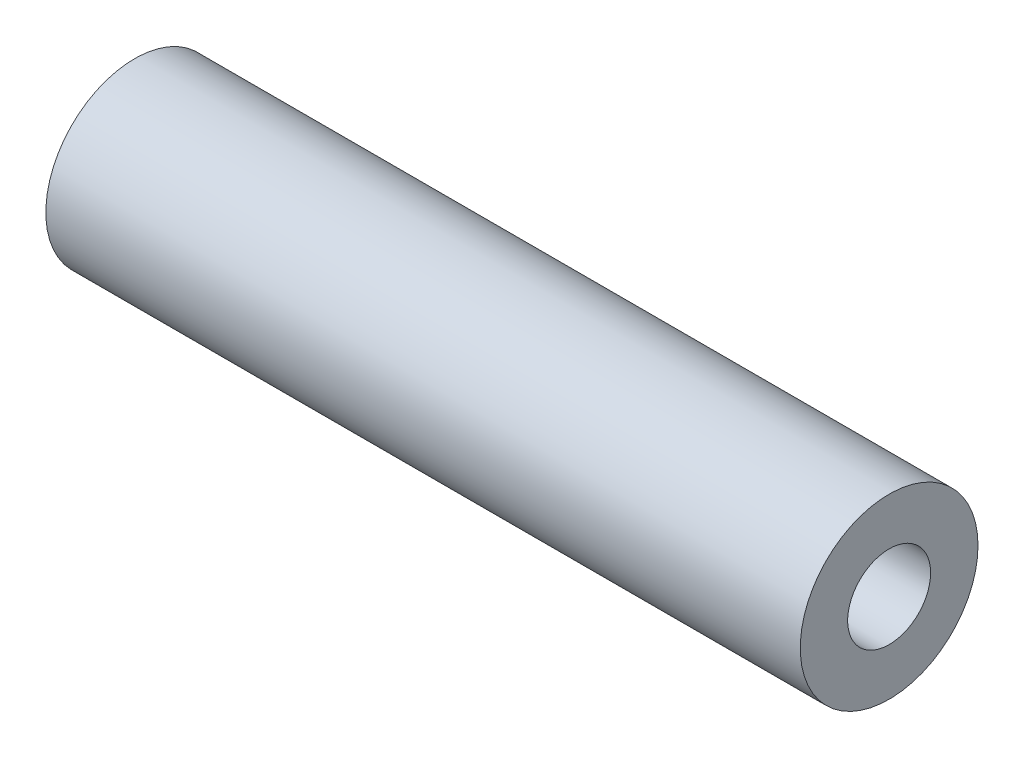
ISO-10303-21;
HEADER;
FILE_DESCRIPTION(('STEP AP214'),'2;1');
FILE_NAME('part.step','',(''),(''),'','','');
FILE_SCHEMA(('AUTOMOTIVE_DESIGN { 1 0 10303 214 1 1 1 1 }'));
ENDSEC;
DATA;
#1=APPLICATION_CONTEXT('core data for automotive mechanical design processes');
#2=APPLICATION_PROTOCOL_DEFINITION('international standard','automotive_design',2000,#1);
#3=PRODUCT_CONTEXT('',#1,'mechanical');
#4=PRODUCT('Part','Part','',(#3));
#5=PRODUCT_RELATED_PRODUCT_CATEGORY('part','',(#4));
#6=PRODUCT_DEFINITION_FORMATION('','',#4);
#7=PRODUCT_DEFINITION_CONTEXT('part definition',#1,'design');
#8=PRODUCT_DEFINITION('design','',#6,#7);
#9=PRODUCT_DEFINITION_SHAPE('','',#8);
#10=(LENGTH_UNIT() NAMED_UNIT(*) SI_UNIT(.MILLI.,.METRE.));
#11=(NAMED_UNIT(*) PLANE_ANGLE_UNIT() SI_UNIT($,.RADIAN.));
#12=(NAMED_UNIT(*) SI_UNIT($,.STERADIAN.) SOLID_ANGLE_UNIT());
#13=UNCERTAINTY_MEASURE_WITH_UNIT(LENGTH_MEASURE(1.E-05),#10,'distance_accuracy_value','');
#14=(GEOMETRIC_REPRESENTATION_CONTEXT(3) GLOBAL_UNCERTAINTY_ASSIGNED_CONTEXT((#13)) GLOBAL_UNIT_ASSIGNED_CONTEXT((#10,
#11,#12)) REPRESENTATION_CONTEXT('',''));
#15=CARTESIAN_POINT('',(0.,0.,0.));
#16=DIRECTION('',(0.,0.,1.));
#17=DIRECTION('',(1.,0.,0.));
#18=AXIS2_PLACEMENT_3D('',#15,#16,#17);
#19=CARTESIAN_POINT('',(38.2,0.,0.));
#20=DIRECTION('',(1.,0.,0.));
#21=DIRECTION('',(0.,0.,-1.));
#22=AXIS2_PLACEMENT_3D('',#19,#20,#21);
#23=PLANE('',#22);
#24=CARTESIAN_POINT('',(38.2,0.,0.));
#25=DIRECTION('',(1.,0.,0.));
#26=DIRECTION('',(0.,0.,-1.));
#27=AXIS2_PLACEMENT_3D('',#24,#25,#26);
#28=CIRCLE('',#27,4.5);
#29=CARTESIAN_POINT('',(38.2,0.,-4.5));
#30=VERTEX_POINT('',#29);
#31=EDGE_CURVE('E10',#30,#30,#28,.T.);
#32=ORIENTED_EDGE('',*,*,#31,.T.);
#33=EDGE_LOOP('',(#32));
#34=FACE_BOUND('',#33,.T.);
#35=CARTESIAN_POINT('',(38.2,0.,0.));
#36=DIRECTION('',(1.,0.,0.));
#37=DIRECTION('',(0.,0.,-1.));
#38=AXIS2_PLACEMENT_3D('',#35,#36,#37);
#39=CIRCLE('',#38,2.1);
#40=CARTESIAN_POINT('',(38.2,0.,-2.1));
#41=VERTEX_POINT('',#40);
#42=EDGE_CURVE('E52',#41,#41,#39,.T.);
#43=ORIENTED_EDGE('',*,*,#42,.F.);
#44=EDGE_LOOP('',(#43));
#45=FACE_BOUND('',#44,.T.);
#46=ADVANCED_FACE('F41',(#34,#45),#23,.T.);
#47=CARTESIAN_POINT('',(0.,0.,0.));
#48=DIRECTION('',(1.,0.,0.));
#49=DIRECTION('',(0.,0.,-1.));
#50=AXIS2_PLACEMENT_3D('',#47,#48,#49);
#51=PLANE('',#50);
#52=CARTESIAN_POINT('',(0.,0.,0.));
#53=DIRECTION('',(1.,0.,0.));
#54=DIRECTION('',(0.,0.,-1.));
#55=AXIS2_PLACEMENT_3D('',#52,#53,#54);
#56=CIRCLE('',#55,4.5);
#57=CARTESIAN_POINT('',(0.,0.,-4.5));
#58=VERTEX_POINT('',#57);
#59=EDGE_CURVE('E45',#58,#58,#56,.T.);
#60=ORIENTED_EDGE('',*,*,#59,.F.);
#61=EDGE_LOOP('',(#60));
#62=FACE_BOUND('',#61,.T.);
#63=CARTESIAN_POINT('',(0.,0.,0.));
#64=DIRECTION('',(1.,0.,0.));
#65=DIRECTION('',(0.,0.,-1.));
#66=AXIS2_PLACEMENT_3D('',#63,#64,#65);
#67=CIRCLE('',#66,2.1);
#68=CARTESIAN_POINT('',(0.,0.,-2.1));
#69=VERTEX_POINT('',#68);
#70=EDGE_CURVE('E54',#69,#69,#67,.T.);
#71=ORIENTED_EDGE('',*,*,#70,.T.);
#72=EDGE_LOOP('',(#71));
#73=FACE_BOUND('',#72,.T.);
#74=ADVANCED_FACE('F64',(#62,#73),#51,.F.);
#75=CARTESIAN_POINT('',(38.2,0.,0.));
#76=DIRECTION('',(-1.,0.,0.));
#77=DIRECTION('',(0.,0.,1.));
#78=AXIS2_PLACEMENT_3D('',#75,#76,#77);
#79=CYLINDRICAL_SURFACE('',#78,4.5);
#80=ORIENTED_EDGE('',*,*,#31,.F.);
#81=EDGE_LOOP('',(#80));
#82=FACE_BOUND('',#81,.T.);
#83=ORIENTED_EDGE('',*,*,#59,.T.);
#84=EDGE_LOOP('',(#83));
#85=FACE_BOUND('',#84,.T.);
#86=ADVANCED_FACE('F43',(#82,#85),#79,.T.);
#87=CARTESIAN_POINT('',(38.2,0.,0.));
#88=DIRECTION('',(-1.,0.,0.));
#89=DIRECTION('',(0.,0.,1.));
#90=AXIS2_PLACEMENT_3D('',#87,#88,#89);
#91=CYLINDRICAL_SURFACE('',#90,2.1);
#92=ORIENTED_EDGE('',*,*,#42,.T.);
#93=EDGE_LOOP('',(#92));
#94=FACE_BOUND('',#93,.T.);
#95=ORIENTED_EDGE('',*,*,#70,.F.);
#96=EDGE_LOOP('',(#95));
#97=FACE_BOUND('',#96,.T.);
#98=ADVANCED_FACE('F60',(#94,#97),#91,.F.);
#99=CLOSED_SHELL('',(#46,#74,#86,#98));
#100=MANIFOLD_SOLID_BREP('B2',#99);
#101=ADVANCED_BREP_SHAPE_REPRESENTATION('',(#18,#100),#14);
#102=SHAPE_DEFINITION_REPRESENTATION(#9,#101);
ENDSEC;
END-ISO-10303-21;
